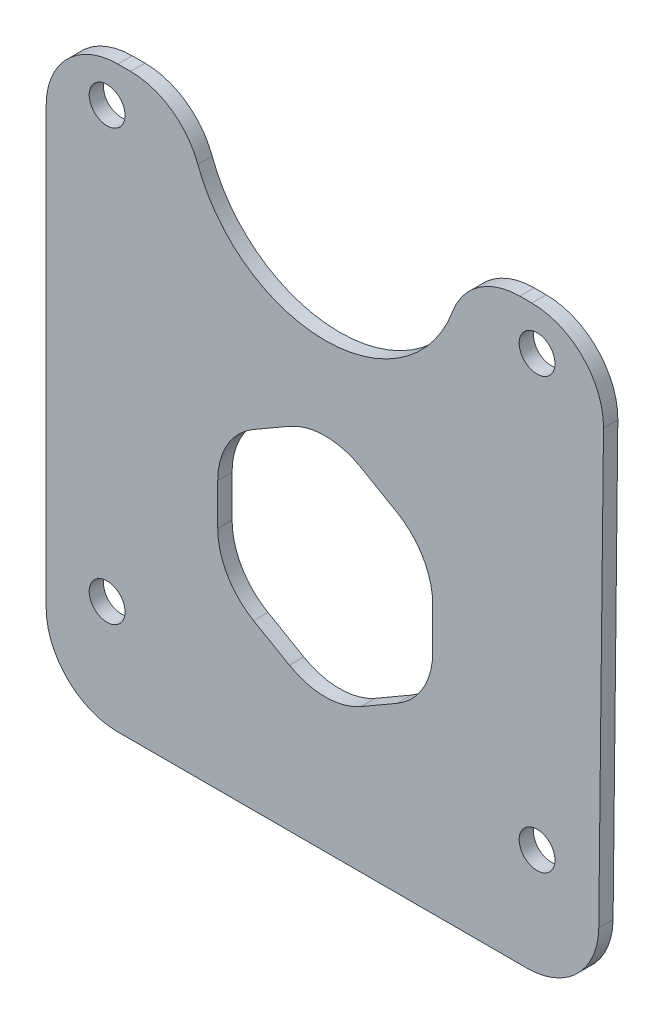
ISO-10303-21;
HEADER;
FILE_DESCRIPTION(('STEP AP214'),'2;1');
FILE_NAME('part.step','',(''),(''),'','','');
FILE_SCHEMA(('AUTOMOTIVE_DESIGN { 1 0 10303 214 1 1 1 1 }'));
ENDSEC;
DATA;
#1=APPLICATION_CONTEXT('core data for automotive mechanical design processes');
#2=APPLICATION_PROTOCOL_DEFINITION('international standard','automotive_design',2000,#1);
#3=PRODUCT_CONTEXT('',#1,'mechanical');
#4=PRODUCT('Part','Part','',(#3));
#5=PRODUCT_RELATED_PRODUCT_CATEGORY('part','',(#4));
#6=PRODUCT_DEFINITION_FORMATION('','',#4);
#7=PRODUCT_DEFINITION_CONTEXT('part definition',#1,'design');
#8=PRODUCT_DEFINITION('design','',#6,#7);
#9=PRODUCT_DEFINITION_SHAPE('','',#8);
#10=(LENGTH_UNIT() NAMED_UNIT(*) SI_UNIT(.MILLI.,.METRE.));
#11=(NAMED_UNIT(*) PLANE_ANGLE_UNIT() SI_UNIT($,.RADIAN.));
#12=(NAMED_UNIT(*) SI_UNIT($,.STERADIAN.) SOLID_ANGLE_UNIT());
#13=UNCERTAINTY_MEASURE_WITH_UNIT(LENGTH_MEASURE(1.E-05),#10,'distance_accuracy_value','');
#14=(GEOMETRIC_REPRESENTATION_CONTEXT(3) GLOBAL_UNCERTAINTY_ASSIGNED_CONTEXT((#13)) GLOBAL_UNIT_ASSIGNED_CONTEXT((#10,
#11,#12)) REPRESENTATION_CONTEXT('',''));
#15=CARTESIAN_POINT('',(0.,0.,0.));
#16=DIRECTION('',(0.,0.,1.));
#17=DIRECTION('',(1.,0.,0.));
#18=AXIS2_PLACEMENT_3D('',#15,#16,#17);
#19=CARTESIAN_POINT('',(0.,0.,2.));
#20=DIRECTION('',(0.,1.,0.));
#21=DIRECTION('',(0.,0.,1.));
#22=AXIS2_PLACEMENT_3D('',#19,#20,#21);
#23=PLANE('',#22);
#24=DIRECTION('',(1.,0.,0.));
#25=VECTOR('',#24,1.);
#26=CARTESIAN_POINT('',(0.,0.,2.));
#27=LINE('',#26,#25);
#28=CARTESIAN_POINT('',(30.,0.,2.));
#29=VERTEX_POINT('',#28);
#30=CARTESIAN_POINT('',(87.1084971040274,0.,2.));
#31=VERTEX_POINT('',#30);
#32=EDGE_CURVE('E228',#29,#31,#27,.T.);
#33=ORIENTED_EDGE('',*,*,#32,.F.);
#34=DIRECTION('',(0.,0.,-1.));
#35=VECTOR('',#34,1.);
#36=CARTESIAN_POINT('',(30.,0.,2.));
#37=LINE('',#36,#35);
#38=CARTESIAN_POINT('',(30.,0.,0.));
#39=VERTEX_POINT('',#38);
#40=EDGE_CURVE('E242',#29,#39,#37,.T.);
#41=ORIENTED_EDGE('',*,*,#40,.T.);
#42=DIRECTION('',(1.,0.,0.));
#43=VECTOR('',#42,1.);
#44=CARTESIAN_POINT('',(0.,0.,0.));
#45=LINE('',#44,#43);
#46=CARTESIAN_POINT('',(87.1084971040274,0.,0.));
#47=VERTEX_POINT('',#46);
#48=EDGE_CURVE('E219',#39,#47,#45,.T.);
#49=ORIENTED_EDGE('',*,*,#48,.T.);
#50=DIRECTION('',(0.,0.,1.));
#51=VECTOR('',#50,1.);
#52=CARTESIAN_POINT('',(87.1084971040274,0.,2.));
#53=LINE('',#52,#51);
#54=EDGE_CURVE('E239',#47,#31,#53,.T.);
#55=ORIENTED_EDGE('',*,*,#54,.T.);
#56=EDGE_LOOP('',(#33,#41,#49,#55));
#57=FACE_BOUND('',#56,.T.);
#58=ADVANCED_FACE('F39',(#57),#23,.F.);
#59=CARTESIAN_POINT('',(0.,0.,2.));
#60=DIRECTION('',(0.,0.,-1.));
#61=DIRECTION('',(-1.,0.,0.));
#62=AXIS2_PLACEMENT_3D('',#59,#60,#61);
#63=PLANE('',#62);
#64=DIRECTION('',(-0.866025403784439,0.5,0.));
#65=VECTOR('',#64,1.);
#66=CARTESIAN_POINT('',(22.1629020004135,38.387272307886,2.));
#67=LINE('',#66,#65);
#68=CARTESIAN_POINT('',(53.9402834671381,20.0405925639311,2.));
#69=VERTEX_POINT('',#68);
#70=CARTESIAN_POINT('',(48.9402834671381,22.9273439098793,2.));
#71=VERTEX_POINT('',#70);
#72=EDGE_CURVE('E358',#69,#71,#67,.T.);
#73=ORIENTED_EDGE('',*,*,#72,.T.);
#74=CARTESIAN_POINT('',(53.9402834671381,31.5875979477236,2.));
#75=DIRECTION('',(0.,0.,-1.));
#76=DIRECTION('',(-1.,0.,0.));
#77=AXIS2_PLACEMENT_3D('',#74,#75,#76);
#78=CIRCLE('',#77,10.);
#79=CARTESIAN_POINT('',(43.9402834671381,31.5875979477236,2.));
#80=VERTEX_POINT('',#79);
#81=EDGE_CURVE('E315',#71,#80,#78,.T.);
#82=ORIENTED_EDGE('',*,*,#81,.T.);
#83=DIRECTION('',(0.,1.,0.));
#84=VECTOR('',#83,1.);
#85=CARTESIAN_POINT('',(43.9402834671381,0.,2.));
#86=LINE('',#85,#84);
#87=CARTESIAN_POINT('',(43.9402834671381,37.3611006396199,2.));
#88=VERTEX_POINT('',#87);
#89=EDGE_CURVE('E361',#80,#88,#86,.T.);
#90=ORIENTED_EDGE('',*,*,#89,.T.);
#91=CARTESIAN_POINT('',(53.9402834671381,37.3611006396199,2.));
#92=DIRECTION('',(0.,0.,-1.));
#93=DIRECTION('',(-1.,0.,0.));
#94=AXIS2_PLACEMENT_3D('',#91,#92,#93);
#95=CIRCLE('',#94,10.);
#96=CARTESIAN_POINT('',(48.9402834671381,46.0213546774643,2.));
#97=VERTEX_POINT('',#96);
#98=EDGE_CURVE('E311',#88,#97,#95,.T.);
#99=ORIENTED_EDGE('',*,*,#98,.T.);
#100=DIRECTION('',(0.866025403784439,0.5,0.));
#101=VECTOR('',#100,1.);
#102=CARTESIAN_POINT('',(-7.69276026684442,13.3242516326217,2.));
#103=LINE('',#102,#101);
#104=CARTESIAN_POINT('',(53.9402834671381,48.9081060234124,2.));
#105=VERTEX_POINT('',#104);
#106=EDGE_CURVE('E364',#97,#105,#103,.T.);
#107=ORIENTED_EDGE('',*,*,#106,.T.);
#108=CARTESIAN_POINT('',(58.9402834671381,40.247851985568,2.));
#109=DIRECTION('',(0.,0.,-1.));
#110=DIRECTION('',(-1.,0.,0.));
#111=AXIS2_PLACEMENT_3D('',#108,#109,#110);
#112=CIRCLE('',#111,10.);
#113=CARTESIAN_POINT('',(63.9402834671381,48.9081060234124,2.));
#114=VERTEX_POINT('',#113);
#115=EDGE_CURVE('E11',#105,#114,#112,.T.);
#116=ORIENTED_EDGE('',*,*,#115,.T.);
#117=DIRECTION('',(0.866025403784439,-0.5,0.));
#118=VECTOR('',#117,1.);
#119=CARTESIAN_POINT('',(37.1629020004135,64.3680344214192,2.));
#120=LINE('',#119,#118);
#121=CARTESIAN_POINT('',(68.9402834671381,46.0213546774643,2.));
#122=VERTEX_POINT('',#121);
#123=EDGE_CURVE('E343',#114,#122,#120,.T.);
#124=ORIENTED_EDGE('',*,*,#123,.T.);
#125=CARTESIAN_POINT('',(63.9402834671381,37.3611006396199,2.));
#126=DIRECTION('',(0.,0.,-1.));
#127=DIRECTION('',(-1.,0.,0.));
#128=AXIS2_PLACEMENT_3D('',#125,#126,#127);
#129=CIRCLE('',#128,10.);
#130=CARTESIAN_POINT('',(73.9402834671381,37.3611006396199,2.));
#131=VERTEX_POINT('',#130);
#132=EDGE_CURVE('E327',#122,#131,#129,.T.);
#133=ORIENTED_EDGE('',*,*,#132,.T.);
#134=DIRECTION('',(0.,-1.,0.));
#135=VECTOR('',#134,1.);
#136=CARTESIAN_POINT('',(73.9402834671381,0.,2.));
#137=LINE('',#136,#135);
#138=CARTESIAN_POINT('',(73.9402834671381,31.5875979477236,2.));
#139=VERTEX_POINT('',#138);
#140=EDGE_CURVE('E345',#131,#139,#137,.T.);
#141=ORIENTED_EDGE('',*,*,#140,.T.);
#142=CARTESIAN_POINT('',(63.9402834671381,31.5875979477236,2.));
#143=DIRECTION('',(0.,0.,-1.));
#144=DIRECTION('',(-1.,0.,0.));
#145=AXIS2_PLACEMENT_3D('',#142,#143,#144);
#146=CIRCLE('',#145,10.);
#147=CARTESIAN_POINT('',(68.9402834671381,22.9273439098793,2.));
#148=VERTEX_POINT('',#147);
#149=EDGE_CURVE('E323',#139,#148,#146,.T.);
#150=ORIENTED_EDGE('',*,*,#149,.T.);
#151=DIRECTION('',(-0.866025403784439,-0.5,0.));
#152=VECTOR('',#151,1.);
#153=CARTESIAN_POINT('',(7.30723973315559,-12.6565104809115,2.));
#154=LINE('',#153,#152);
#155=CARTESIAN_POINT('',(63.9402834671381,20.0405925639311,2.));
#156=VERTEX_POINT('',#155);
#157=EDGE_CURVE('E349',#148,#156,#154,.T.);
#158=ORIENTED_EDGE('',*,*,#157,.T.);
#159=CARTESIAN_POINT('',(58.9402834671381,28.7008466017755,2.));
#160=DIRECTION('',(0.,0.,-1.));
#161=DIRECTION('',(-1.,0.,0.));
#162=AXIS2_PLACEMENT_3D('',#159,#160,#161);
#163=CIRCLE('',#162,10.);
#164=EDGE_CURVE('E319',#156,#69,#163,.T.);
#165=ORIENTED_EDGE('',*,*,#164,.T.);
#166=EDGE_LOOP('',(#73,#82,#90,#99,#107,#116,#124,#133,#141,#150,#158,#165));
#167=FACE_BOUND('',#166,.T.);
#168=CARTESIAN_POINT('',(28.5,15.,2.));
#169=DIRECTION('',(0.,0.,1.));
#170=DIRECTION('',(1.,0.,0.));
#171=AXIS2_PLACEMENT_3D('',#168,#169,#170);
#172=CIRCLE('',#171,2.5);
#173=CARTESIAN_POINT('',(31.,15.,2.));
#174=VERTEX_POINT('',#173);
#175=EDGE_CURVE('E390',#174,#174,#172,.T.);
#176=ORIENTED_EDGE('',*,*,#175,.F.);
#177=EDGE_LOOP('',(#176));
#178=FACE_BOUND('',#177,.T.);
#179=CARTESIAN_POINT('',(88.5,15.,2.));
#180=DIRECTION('',(0.,0.,1.));
#181=DIRECTION('',(1.,0.,0.));
#182=AXIS2_PLACEMENT_3D('',#179,#180,#181);
#183=CIRCLE('',#182,2.50000000000001);
#184=CARTESIAN_POINT('',(91.,15.,2.));
#185=VERTEX_POINT('',#184);
#186=EDGE_CURVE('E398',#185,#185,#183,.T.);
#187=ORIENTED_EDGE('',*,*,#186,.F.);
#188=EDGE_LOOP('',(#187));
#189=FACE_BOUND('',#188,.T.);
#190=CARTESIAN_POINT('',(88.5,75.,2.));
#191=DIRECTION('',(0.,0.,1.));
#192=DIRECTION('',(1.,0.,0.));
#193=AXIS2_PLACEMENT_3D('',#190,#191,#192);
#194=CIRCLE('',#193,2.5);
#195=CARTESIAN_POINT('',(91.,75.,2.));
#196=VERTEX_POINT('',#195);
#197=EDGE_CURVE('E395',#196,#196,#194,.T.);
#198=ORIENTED_EDGE('',*,*,#197,.F.);
#199=EDGE_LOOP('',(#198));
#200=FACE_BOUND('',#199,.T.);
#201=CARTESIAN_POINT('',(28.5,75.,2.));
#202=DIRECTION('',(0.,0.,1.));
#203=DIRECTION('',(1.,0.,0.));
#204=AXIS2_PLACEMENT_3D('',#201,#202,#203);
#205=CIRCLE('',#204,2.5);
#206=CARTESIAN_POINT('',(31.,75.,2.));
#207=VERTEX_POINT('',#206);
#208=EDGE_CURVE('E391',#207,#207,#205,.T.);
#209=ORIENTED_EDGE('',*,*,#208,.F.);
#210=EDGE_LOOP('',(#209));
#211=FACE_BOUND('',#210,.T.);
#212=DIRECTION('',(-1.,0.,0.));
#213=VECTOR('',#212,1.);
#214=CARTESIAN_POINT('',(0.,80.7177240732172,2.));
#215=LINE('',#214,#213);
#216=CARTESIAN_POINT('',(31.7825956576373,80.7177240732172,2.));
#217=VERTEX_POINT('',#216);
#218=CARTESIAN_POINT('',(30.,80.7177240732172,2.));
#219=VERTEX_POINT('',#218);
#220=EDGE_CURVE('E375',#217,#219,#215,.T.);
#221=ORIENTED_EDGE('',*,*,#220,.T.);
#222=CARTESIAN_POINT('',(30.,70.7177240732172,2.));
#223=DIRECTION('',(0.,0.,-1.));
#224=DIRECTION('',(-1.,0.,0.));
#225=AXIS2_PLACEMENT_3D('',#222,#223,#224);
#226=CIRCLE('',#225,10.);
#227=CARTESIAN_POINT('',(20.,70.7177240732172,2.));
#228=VERTEX_POINT('',#227);
#229=EDGE_CURVE('E266',#219,#228,#226,.F.);
#230=ORIENTED_EDGE('',*,*,#229,.T.);
#231=DIRECTION('',(0.,-1.,0.));
#232=VECTOR('',#231,1.);
#233=CARTESIAN_POINT('',(20.,0.,2.));
#234=LINE('',#233,#232);
#235=CARTESIAN_POINT('',(20.,10.,2.));
#236=VERTEX_POINT('',#235);
#237=EDGE_CURVE('E388',#228,#236,#234,.T.);
#238=ORIENTED_EDGE('',*,*,#237,.T.);
#239=CARTESIAN_POINT('',(30.,10.,2.));
#240=DIRECTION('',(0.,0.,-1.));
#241=DIRECTION('',(-1.,0.,0.));
#242=AXIS2_PLACEMENT_3D('',#239,#240,#241);
#243=CIRCLE('',#242,10.);
#244=EDGE_CURVE('E227',#236,#29,#243,.F.);
#245=ORIENTED_EDGE('',*,*,#244,.T.);
#246=ORIENTED_EDGE('',*,*,#32,.T.);
#247=CARTESIAN_POINT('',(87.1084971040274,10.,2.));
#248=DIRECTION('',(0.,0.,-1.));
#249=DIRECTION('',(-1.,0.,0.));
#250=AXIS2_PLACEMENT_3D('',#247,#248,#249);
#251=CIRCLE('',#250,10.);
#252=CARTESIAN_POINT('',(97.1079021023733,9.89091434991413,2.));
#253=VERTEX_POINT('',#252);
#254=EDGE_CURVE('E223',#31,#253,#251,.F.);
#255=ORIENTED_EDGE('',*,*,#254,.T.);
#256=DIRECTION('',(0.0109085650085876,0.999940499834592,0.));
#257=VECTOR('',#256,1.);
#258=CARTESIAN_POINT('',(96.988457311317,-1.05806784687503,2.));
#259=LINE('',#258,#257);
#260=CARTESIAN_POINT('',(97.7702847544769,70.6086384231313,2.));
#261=VERTEX_POINT('',#260);
#262=EDGE_CURVE('E384',#253,#261,#259,.T.);
#263=ORIENTED_EDGE('',*,*,#262,.T.);
#264=CARTESIAN_POINT('',(87.770879756131,70.7177240732172,2.));
#265=DIRECTION('',(0.,0.,-1.));
#266=DIRECTION('',(-1.,0.,0.));
#267=AXIS2_PLACEMENT_3D('',#264,#265,#266);
#268=CIRCLE('',#267,10.);
#269=CARTESIAN_POINT('',(87.770879756131,80.7177240732172,2.));
#270=VERTEX_POINT('',#269);
#271=EDGE_CURVE('E264',#261,#270,#268,.F.);
#272=ORIENTED_EDGE('',*,*,#271,.T.);
#273=DIRECTION('',(-1.,0.,0.));
#274=VECTOR('',#273,1.);
#275=CARTESIAN_POINT('',(0.,80.7177240732172,2.));
#276=LINE('',#275,#274);
#277=CARTESIAN_POINT('',(86.0979712766388,80.7177240732172,2.));
#278=VERTEX_POINT('',#277);
#279=EDGE_CURVE('E378',#270,#278,#276,.T.);
#280=ORIENTED_EDGE('',*,*,#279,.T.);
#281=CARTESIAN_POINT('',(86.0979712766388,70.7177240732172,2.));
#282=DIRECTION('',(0.,0.,-1.));
#283=DIRECTION('',(-1.,0.,0.));
#284=AXIS2_PLACEMENT_3D('',#281,#282,#283);
#285=CIRCLE('',#284,10.);
#286=CARTESIAN_POINT('',(76.713927806457,74.1731152449571,2.));
#287=VERTEX_POINT('',#286);
#288=EDGE_CURVE('E260',#278,#287,#285,.F.);
#289=ORIENTED_EDGE('',*,*,#288,.T.);
#290=CARTESIAN_POINT('',(58.9402834671381,80.7177240732172,2.));
#291=DIRECTION('',(0.,0.,-1.));
#292=DIRECTION('',(-1.,0.,0.));
#293=AXIS2_PLACEMENT_3D('',#290,#291,#292);
#294=CIRCLE('',#293,18.9402834671381);
#295=CARTESIAN_POINT('',(41.1666391278191,74.1731152449571,2.));
#296=VERTEX_POINT('',#295);
#297=EDGE_CURVE('E212',#287,#296,#294,.T.);
#298=ORIENTED_EDGE('',*,*,#297,.T.);
#299=CARTESIAN_POINT('',(31.7825956576373,70.7177240732172,2.));
#300=DIRECTION('',(0.,0.,-1.));
#301=DIRECTION('',(-1.,0.,0.));
#302=AXIS2_PLACEMENT_3D('',#299,#300,#301);
#303=CIRCLE('',#302,10.);
#304=EDGE_CURVE('E262',#296,#217,#303,.F.);
#305=ORIENTED_EDGE('',*,*,#304,.T.);
#306=EDGE_LOOP('',(#221,#230,#238,#245,#246,#255,#263,#272,#280,#289,#298,#305));
#307=FACE_BOUND('',#306,.T.);
#308=ADVANCED_FACE('F420',(#167,#178,#189,#200,#211,#307),#63,.F.);
#309=CARTESIAN_POINT('',(0.,0.,0.));
#310=DIRECTION('',(0.,0.,-1.));
#311=DIRECTION('',(-1.,0.,0.));
#312=AXIS2_PLACEMENT_3D('',#309,#310,#311);
#313=PLANE('',#312);
#314=DIRECTION('',(0.866025403784439,0.5,0.));
#315=VECTOR('',#314,1.);
#316=CARTESIAN_POINT('',(43.9402834671381,43.1346033315162,0.));
#317=LINE('',#316,#315);
#318=CARTESIAN_POINT('',(48.9402834671381,46.0213546774643,0.));
#319=VERTEX_POINT('',#318);
#320=CARTESIAN_POINT('',(53.9402834671381,48.9081060234124,0.));
#321=VERTEX_POINT('',#320);
#322=EDGE_CURVE('E332',#319,#321,#317,.T.);
#323=ORIENTED_EDGE('',*,*,#322,.F.);
#324=CARTESIAN_POINT('',(53.9402834671381,37.3611006396199,0.));
#325=DIRECTION('',(0.,0.,-1.));
#326=DIRECTION('',(-1.,0.,0.));
#327=AXIS2_PLACEMENT_3D('',#324,#325,#326);
#328=CIRCLE('',#327,10.);
#329=CARTESIAN_POINT('',(43.9402834671381,37.3611006396199,0.));
#330=VERTEX_POINT('',#329);
#331=EDGE_CURVE('E309',#319,#330,#328,.F.);
#332=ORIENTED_EDGE('',*,*,#331,.T.);
#333=DIRECTION('',(0.,1.,0.));
#334=VECTOR('',#333,1.);
#335=CARTESIAN_POINT('',(43.9402834671381,25.8140952558274,0.));
#336=LINE('',#335,#334);
#337=CARTESIAN_POINT('',(43.9402834671381,31.5875979477236,0.));
#338=VERTEX_POINT('',#337);
#339=EDGE_CURVE('E346',#338,#330,#336,.T.);
#340=ORIENTED_EDGE('',*,*,#339,.F.);
#341=CARTESIAN_POINT('',(53.9402834671381,31.5875979477236,0.));
#342=DIRECTION('',(0.,0.,-1.));
#343=DIRECTION('',(-1.,0.,0.));
#344=AXIS2_PLACEMENT_3D('',#341,#342,#343);
#345=CIRCLE('',#344,10.);
#346=CARTESIAN_POINT('',(48.9402834671381,22.9273439098793,0.));
#347=VERTEX_POINT('',#346);
#348=EDGE_CURVE('E313',#338,#347,#345,.F.);
#349=ORIENTED_EDGE('',*,*,#348,.T.);
#350=DIRECTION('',(-0.866025403784439,0.5,0.));
#351=VECTOR('',#350,1.);
#352=CARTESIAN_POINT('',(58.9402834671381,17.153841217983,0.));
#353=LINE('',#352,#351);
#354=CARTESIAN_POINT('',(53.9402834671381,20.0405925639311,0.));
#355=VERTEX_POINT('',#354);
#356=EDGE_CURVE('E352',#355,#347,#353,.T.);
#357=ORIENTED_EDGE('',*,*,#356,.F.);
#358=CARTESIAN_POINT('',(58.9402834671381,28.7008466017755,0.));
#359=DIRECTION('',(0.,0.,-1.));
#360=DIRECTION('',(-1.,0.,0.));
#361=AXIS2_PLACEMENT_3D('',#358,#359,#360);
#362=CIRCLE('',#361,10.);
#363=CARTESIAN_POINT('',(63.9402834671381,20.0405925639311,0.));
#364=VERTEX_POINT('',#363);
#365=EDGE_CURVE('E317',#355,#364,#362,.F.);
#366=ORIENTED_EDGE('',*,*,#365,.T.);
#367=DIRECTION('',(-0.866025403784439,-0.5,0.));
#368=VECTOR('',#367,1.);
#369=CARTESIAN_POINT('',(73.9402834671381,25.8140952558274,0.));
#370=LINE('',#369,#368);
#371=CARTESIAN_POINT('',(68.9402834671381,22.9273439098793,0.));
#372=VERTEX_POINT('',#371);
#373=EDGE_CURVE('E535',#372,#364,#370,.T.);
#374=ORIENTED_EDGE('',*,*,#373,.F.);
#375=CARTESIAN_POINT('',(63.9402834671381,31.5875979477236,0.));
#376=DIRECTION('',(0.,0.,-1.));
#377=DIRECTION('',(-1.,0.,0.));
#378=AXIS2_PLACEMENT_3D('',#375,#376,#377);
#379=CIRCLE('',#378,10.);
#380=CARTESIAN_POINT('',(73.9402834671381,31.5875979477236,0.));
#381=VERTEX_POINT('',#380);
#382=EDGE_CURVE('E321',#372,#381,#379,.F.);
#383=ORIENTED_EDGE('',*,*,#382,.T.);
#384=DIRECTION('',(0.,-1.,0.));
#385=VECTOR('',#384,1.);
#386=CARTESIAN_POINT('',(73.9402834671381,43.1346033315162,0.));
#387=LINE('',#386,#385);
#388=CARTESIAN_POINT('',(73.9402834671381,37.3611006396199,0.));
#389=VERTEX_POINT('',#388);
#390=EDGE_CURVE('E526',#389,#381,#387,.T.);
#391=ORIENTED_EDGE('',*,*,#390,.F.);
#392=CARTESIAN_POINT('',(63.9402834671381,37.3611006396199,0.));
#393=DIRECTION('',(0.,0.,-1.));
#394=DIRECTION('',(-1.,0.,0.));
#395=AXIS2_PLACEMENT_3D('',#392,#393,#394);
#396=CIRCLE('',#395,10.);
#397=CARTESIAN_POINT('',(68.9402834671381,46.0213546774643,0.));
#398=VERTEX_POINT('',#397);
#399=EDGE_CURVE('E325',#389,#398,#396,.F.);
#400=ORIENTED_EDGE('',*,*,#399,.T.);
#401=DIRECTION('',(0.866025403784438,-0.5,0.));
#402=VECTOR('',#401,1.);
#403=CARTESIAN_POINT('',(58.9402834671381,51.7948573693605,0.));
#404=LINE('',#403,#402);
#405=CARTESIAN_POINT('',(63.9402834671381,48.9081060234124,0.));
#406=VERTEX_POINT('',#405);
#407=EDGE_CURVE('E333',#406,#398,#404,.T.);
#408=ORIENTED_EDGE('',*,*,#407,.F.);
#409=CARTESIAN_POINT('',(58.9402834671381,40.247851985568,0.));
#410=DIRECTION('',(0.,0.,-1.));
#411=DIRECTION('',(-1.,0.,0.));
#412=AXIS2_PLACEMENT_3D('',#409,#410,#411);
#413=CIRCLE('',#412,10.);
#414=EDGE_CURVE('E47',#406,#321,#413,.F.);
#415=ORIENTED_EDGE('',*,*,#414,.T.);
#416=EDGE_LOOP('',(#323,#332,#340,#349,#357,#366,#374,#383,#391,#400,#408,#415));
#417=FACE_BOUND('',#416,.T.);
#418=DIRECTION('',(0.,-1.,0.));
#419=VECTOR('',#418,1.);
#420=CARTESIAN_POINT('',(20.,0.,0.));
#421=LINE('',#420,#419);
#422=CARTESIAN_POINT('',(20.,70.7177240732172,0.));
#423=VERTEX_POINT('',#422);
#424=CARTESIAN_POINT('',(20.,10.,0.));
#425=VERTEX_POINT('',#424);
#426=EDGE_CURVE('E201',#423,#425,#421,.T.);
#427=ORIENTED_EDGE('',*,*,#426,.F.);
#428=CARTESIAN_POINT('',(30.,70.7177240732172,0.));
#429=DIRECTION('',(0.,0.,-1.));
#430=DIRECTION('',(-1.,0.,0.));
#431=AXIS2_PLACEMENT_3D('',#428,#429,#430);
#432=CIRCLE('',#431,10.);
#433=CARTESIAN_POINT('',(30.,80.7177240732172,0.));
#434=VERTEX_POINT('',#433);
#435=EDGE_CURVE('E253',#423,#434,#432,.T.);
#436=ORIENTED_EDGE('',*,*,#435,.T.);
#437=DIRECTION('',(-1.,0.,0.));
#438=VECTOR('',#437,1.);
#439=CARTESIAN_POINT('',(40.,80.7177240732172,0.));
#440=LINE('',#439,#438);
#441=CARTESIAN_POINT('',(31.7825956576373,80.7177240732172,0.));
#442=VERTEX_POINT('',#441);
#443=EDGE_CURVE('E372',#442,#434,#440,.T.);
#444=ORIENTED_EDGE('',*,*,#443,.F.);
#445=CARTESIAN_POINT('',(31.7825956576373,70.7177240732172,0.));
#446=DIRECTION('',(0.,0.,-1.));
#447=DIRECTION('',(-1.,0.,0.));
#448=AXIS2_PLACEMENT_3D('',#445,#446,#447);
#449=CIRCLE('',#448,10.);
#450=CARTESIAN_POINT('',(41.1666391278191,74.1731152449571,0.));
#451=VERTEX_POINT('',#450);
#452=EDGE_CURVE('E249',#442,#451,#449,.T.);
#453=ORIENTED_EDGE('',*,*,#452,.T.);
#454=CARTESIAN_POINT('',(58.9402834671381,80.7177240732172,0.));
#455=DIRECTION('',(0.,0.,-1.));
#456=DIRECTION('',(-1.,0.,0.));
#457=AXIS2_PLACEMENT_3D('',#454,#455,#456);
#458=CIRCLE('',#457,18.9402834671381);
#459=CARTESIAN_POINT('',(76.713927806457,74.1731152449571,0.));
#460=VERTEX_POINT('',#459);
#461=EDGE_CURVE('E369',#460,#451,#458,.T.);
#462=ORIENTED_EDGE('',*,*,#461,.F.);
#463=CARTESIAN_POINT('',(86.0979712766388,70.7177240732172,0.));
#464=DIRECTION('',(0.,0.,-1.));
#465=DIRECTION('',(-1.,0.,0.));
#466=AXIS2_PLACEMENT_3D('',#463,#464,#465);
#467=CIRCLE('',#466,10.);
#468=CARTESIAN_POINT('',(86.0979712766388,80.7177240732172,0.));
#469=VERTEX_POINT('',#468);
#470=EDGE_CURVE('E247',#460,#469,#467,.T.);
#471=ORIENTED_EDGE('',*,*,#470,.T.);
#472=DIRECTION('',(-1.,0.,0.));
#473=VECTOR('',#472,1.);
#474=CARTESIAN_POINT('',(97.8805669342762,80.7177240732172,0.));
#475=LINE('',#474,#473);
#476=CARTESIAN_POINT('',(87.770879756131,80.7177240732172,0.));
#477=VERTEX_POINT('',#476);
#478=EDGE_CURVE('E366',#477,#469,#475,.T.);
#479=ORIENTED_EDGE('',*,*,#478,.F.);
#480=CARTESIAN_POINT('',(87.770879756131,70.7177240732172,0.));
#481=DIRECTION('',(0.,0.,-1.));
#482=DIRECTION('',(-1.,0.,0.));
#483=AXIS2_PLACEMENT_3D('',#480,#481,#482);
#484=CIRCLE('',#483,10.);
#485=CARTESIAN_POINT('',(97.7702847544769,70.6086384231313,0.));
#486=VERTEX_POINT('',#485);
#487=EDGE_CURVE('E251',#477,#486,#484,.T.);
#488=ORIENTED_EDGE('',*,*,#487,.T.);
#489=DIRECTION('',(0.0109085650085876,0.999940499834592,0.));
#490=VECTOR('',#489,1.);
#491=CARTESIAN_POINT('',(97.,0.,0.));
#492=LINE('',#491,#490);
#493=CARTESIAN_POINT('',(97.1079021023734,9.89091434991412,0.));
#494=VERTEX_POINT('',#493);
#495=EDGE_CURVE('E211',#494,#486,#492,.T.);
#496=ORIENTED_EDGE('',*,*,#495,.F.);
#497=CARTESIAN_POINT('',(87.1084971040274,10.,0.));
#498=DIRECTION('',(0.,0.,-1.));
#499=DIRECTION('',(-1.,0.,0.));
#500=AXIS2_PLACEMENT_3D('',#497,#498,#499);
#501=CIRCLE('',#500,10.);
#502=EDGE_CURVE('E224',#494,#47,#501,.T.);
#503=ORIENTED_EDGE('',*,*,#502,.T.);
#504=ORIENTED_EDGE('',*,*,#48,.F.);
#505=CARTESIAN_POINT('',(30.,10.,0.));
#506=DIRECTION('',(0.,0.,-1.));
#507=DIRECTION('',(-1.,0.,0.));
#508=AXIS2_PLACEMENT_3D('',#505,#506,#507);
#509=CIRCLE('',#508,10.);
#510=EDGE_CURVE('E215',#39,#425,#509,.T.);
#511=ORIENTED_EDGE('',*,*,#510,.T.);
#512=EDGE_LOOP('',(#427,#436,#444,#453,#462,#471,#479,#488,#496,#503,#504,#511));
#513=FACE_BOUND('',#512,.T.);
#514=CARTESIAN_POINT('',(28.5,15.,0.));
#515=DIRECTION('',(0.,0.,-1.));
#516=DIRECTION('',(-1.,0.,0.));
#517=AXIS2_PLACEMENT_3D('',#514,#515,#516);
#518=CIRCLE('',#517,2.5);
#519=CARTESIAN_POINT('',(26.,15.,0.));
#520=VERTEX_POINT('',#519);
#521=EDGE_CURVE('E234',#520,#520,#518,.T.);
#522=ORIENTED_EDGE('',*,*,#521,.F.);
#523=EDGE_LOOP('',(#522));
#524=FACE_BOUND('',#523,.T.);
#525=CARTESIAN_POINT('',(88.5,15.,0.));
#526=DIRECTION('',(0.,0.,-1.));
#527=DIRECTION('',(-1.,0.,0.));
#528=AXIS2_PLACEMENT_3D('',#525,#526,#527);
#529=CIRCLE('',#528,2.50000000000001);
#530=CARTESIAN_POINT('',(86.,15.,0.));
#531=VERTEX_POINT('',#530);
#532=EDGE_CURVE('E408',#531,#531,#529,.T.);
#533=ORIENTED_EDGE('',*,*,#532,.F.);
#534=EDGE_LOOP('',(#533));
#535=FACE_BOUND('',#534,.T.);
#536=CARTESIAN_POINT('',(88.5,75.,0.));
#537=DIRECTION('',(0.,0.,-1.));
#538=DIRECTION('',(-1.,0.,0.));
#539=AXIS2_PLACEMENT_3D('',#536,#537,#538);
#540=CIRCLE('',#539,2.5);
#541=CARTESIAN_POINT('',(86.,75.,0.));
#542=VERTEX_POINT('',#541);
#543=EDGE_CURVE('E406',#542,#542,#540,.T.);
#544=ORIENTED_EDGE('',*,*,#543,.F.);
#545=EDGE_LOOP('',(#544));
#546=FACE_BOUND('',#545,.T.);
#547=CARTESIAN_POINT('',(28.5,75.,0.));
#548=DIRECTION('',(0.,0.,-1.));
#549=DIRECTION('',(-1.,0.,0.));
#550=AXIS2_PLACEMENT_3D('',#547,#548,#549);
#551=CIRCLE('',#550,2.5);
#552=CARTESIAN_POINT('',(26.,75.,0.));
#553=VERTEX_POINT('',#552);
#554=EDGE_CURVE('E394',#553,#553,#551,.T.);
#555=ORIENTED_EDGE('',*,*,#554,.F.);
#556=EDGE_LOOP('',(#555));
#557=FACE_BOUND('',#556,.T.);
#558=ADVANCED_FACE('F216',(#417,#513,#524,#535,#546,#557),#313,.T.);
#559=CARTESIAN_POINT('',(28.5,75.,-28.));
#560=DIRECTION('',(0.,0.,1.));
#561=DIRECTION('',(1.,0.,0.));
#562=AXIS2_PLACEMENT_3D('',#559,#560,#561);
#563=CYLINDRICAL_SURFACE('',#562,2.5);
#564=ORIENTED_EDGE('',*,*,#554,.T.);
#565=EDGE_LOOP('',(#564));
#566=FACE_BOUND('',#565,.T.);
#567=ORIENTED_EDGE('',*,*,#208,.T.);
#568=EDGE_LOOP('',(#567));
#569=FACE_BOUND('',#568,.T.);
#570=ADVANCED_FACE('F419',(#566,#569),#563,.F.);
#571=CARTESIAN_POINT('',(88.5,75.,-28.));
#572=DIRECTION('',(0.,0.,1.));
#573=DIRECTION('',(1.,0.,0.));
#574=AXIS2_PLACEMENT_3D('',#571,#572,#573);
#575=CYLINDRICAL_SURFACE('',#574,2.5);
#576=ORIENTED_EDGE('',*,*,#543,.T.);
#577=EDGE_LOOP('',(#576));
#578=FACE_BOUND('',#577,.T.);
#579=ORIENTED_EDGE('',*,*,#197,.T.);
#580=EDGE_LOOP('',(#579));
#581=FACE_BOUND('',#580,.T.);
#582=ADVANCED_FACE('F429',(#578,#581),#575,.F.);
#583=CARTESIAN_POINT('',(88.5,15.,-28.));
#584=DIRECTION('',(0.,0.,1.));
#585=DIRECTION('',(1.,0.,0.));
#586=AXIS2_PLACEMENT_3D('',#583,#584,#585);
#587=CYLINDRICAL_SURFACE('',#586,2.50000000000001);
#588=ORIENTED_EDGE('',*,*,#532,.T.);
#589=EDGE_LOOP('',(#588));
#590=FACE_BOUND('',#589,.T.);
#591=ORIENTED_EDGE('',*,*,#186,.T.);
#592=EDGE_LOOP('',(#591));
#593=FACE_BOUND('',#592,.T.);
#594=ADVANCED_FACE('F581',(#590,#593),#587,.F.);
#595=CARTESIAN_POINT('',(28.5,15.,-28.));
#596=DIRECTION('',(0.,0.,1.));
#597=DIRECTION('',(1.,0.,0.));
#598=AXIS2_PLACEMENT_3D('',#595,#596,#597);
#599=CYLINDRICAL_SURFACE('',#598,2.5);
#600=ORIENTED_EDGE('',*,*,#521,.T.);
#601=EDGE_LOOP('',(#600));
#602=FACE_BOUND('',#601,.T.);
#603=ORIENTED_EDGE('',*,*,#175,.T.);
#604=EDGE_LOOP('',(#603));
#605=FACE_BOUND('',#604,.T.);
#606=ADVANCED_FACE('F415',(#602,#605),#599,.F.);
#607=CARTESIAN_POINT('',(97.,0.,10.));
#608=DIRECTION('',(-0.999940499834592,0.0109085650085876,0.));
#609=DIRECTION('',(-0.0109085650085876,-0.999940499834592,0.));
#610=AXIS2_PLACEMENT_3D('',#607,#608,#609);
#611=PLANE('',#610);
#612=ORIENTED_EDGE('',*,*,#495,.T.);
#613=DIRECTION('',(0.,0.,-1.));
#614=VECTOR('',#613,1.);
#615=CARTESIAN_POINT('',(97.7702847544769,70.6086384231313,10.));
#616=LINE('',#615,#614);
#617=EDGE_CURVE('E273',#486,#261,#616,.F.);
#618=ORIENTED_EDGE('',*,*,#617,.T.);
#619=ORIENTED_EDGE('',*,*,#262,.F.);
#620=DIRECTION('',(0.,0.,1.));
#621=VECTOR('',#620,1.);
#622=CARTESIAN_POINT('',(97.1079021023734,9.89091434991413,10.));
#623=LINE('',#622,#621);
#624=EDGE_CURVE('E244',#253,#494,#623,.F.);
#625=ORIENTED_EDGE('',*,*,#624,.T.);
#626=EDGE_LOOP('',(#612,#618,#619,#625));
#627=FACE_BOUND('',#626,.T.);
#628=ADVANCED_FACE('F470',(#627),#611,.F.);
#629=CARTESIAN_POINT('',(20.,0.,10.));
#630=DIRECTION('',(1.,0.,0.));
#631=DIRECTION('',(0.,1.,0.));
#632=AXIS2_PLACEMENT_3D('',#629,#630,#631);
#633=PLANE('',#632);
#634=ORIENTED_EDGE('',*,*,#237,.F.);
#635=DIRECTION('',(0.,0.,-1.));
#636=VECTOR('',#635,1.);
#637=CARTESIAN_POINT('',(20.,70.7177240732172,10.));
#638=LINE('',#637,#636);
#639=EDGE_CURVE('E209',#228,#423,#638,.T.);
#640=ORIENTED_EDGE('',*,*,#639,.T.);
#641=ORIENTED_EDGE('',*,*,#426,.T.);
#642=DIRECTION('',(0.,0.,-1.));
#643=VECTOR('',#642,1.);
#644=CARTESIAN_POINT('',(20.,10.,10.));
#645=LINE('',#644,#643);
#646=EDGE_CURVE('E206',#425,#236,#645,.F.);
#647=ORIENTED_EDGE('',*,*,#646,.T.);
#648=EDGE_LOOP('',(#634,#640,#641,#647));
#649=FACE_BOUND('',#648,.T.);
#650=ADVANCED_FACE('F204',(#649),#633,.F.);
#651=CARTESIAN_POINT('',(30.,10.,2.));
#652=DIRECTION('',(0.,0.,-1.));
#653=DIRECTION('',(-1.,0.,0.));
#654=AXIS2_PLACEMENT_3D('',#651,#652,#653);
#655=CYLINDRICAL_SURFACE('',#654,10.);
#656=ORIENTED_EDGE('',*,*,#244,.F.);
#657=ORIENTED_EDGE('',*,*,#646,.F.);
#658=ORIENTED_EDGE('',*,*,#510,.F.);
#659=ORIENTED_EDGE('',*,*,#40,.F.);
#660=EDGE_LOOP('',(#656,#657,#658,#659));
#661=FACE_BOUND('',#660,.T.);
#662=ADVANCED_FACE('F226',(#661),#655,.T.);
#663=CARTESIAN_POINT('',(87.1084971040274,10.,2.));
#664=DIRECTION('',(0.,0.,1.));
#665=DIRECTION('',(1.,0.,0.));
#666=AXIS2_PLACEMENT_3D('',#663,#664,#665);
#667=CYLINDRICAL_SURFACE('',#666,10.);
#668=ORIENTED_EDGE('',*,*,#502,.F.);
#669=ORIENTED_EDGE('',*,*,#624,.F.);
#670=ORIENTED_EDGE('',*,*,#254,.F.);
#671=ORIENTED_EDGE('',*,*,#54,.F.);
#672=EDGE_LOOP('',(#668,#669,#670,#671));
#673=FACE_BOUND('',#672,.T.);
#674=ADVANCED_FACE('F474',(#673),#667,.T.);
#675=CARTESIAN_POINT('',(58.9402834671381,80.7177240732172,10.));
#676=DIRECTION('',(0.,0.,-1.));
#677=DIRECTION('',(-1.,0.,0.));
#678=AXIS2_PLACEMENT_3D('',#675,#676,#677);
#679=CYLINDRICAL_SURFACE('',#678,18.9402834671381);
#680=ORIENTED_EDGE('',*,*,#461,.T.);
#681=DIRECTION('',(0.,0.,-1.));
#682=VECTOR('',#681,1.);
#683=CARTESIAN_POINT('',(41.1666391278191,74.1731152449571,10.));
#684=LINE('',#683,#682);
#685=EDGE_CURVE('E278',#451,#296,#684,.F.);
#686=ORIENTED_EDGE('',*,*,#685,.T.);
#687=ORIENTED_EDGE('',*,*,#297,.F.);
#688=DIRECTION('',(0.,0.,-1.));
#689=VECTOR('',#688,1.);
#690=CARTESIAN_POINT('',(76.713927806457,74.1731152449571,10.));
#691=LINE('',#690,#689);
#692=EDGE_CURVE('E275',#287,#460,#691,.T.);
#693=ORIENTED_EDGE('',*,*,#692,.T.);
#694=EDGE_LOOP('',(#680,#686,#687,#693));
#695=FACE_BOUND('',#694,.T.);
#696=ADVANCED_FACE('F451',(#695),#679,.F.);
#697=CARTESIAN_POINT('',(97.8805669342762,80.7177240732172,10.));
#698=DIRECTION('',(0.,-1.,0.));
#699=DIRECTION('',(0.,0.,-1.));
#700=AXIS2_PLACEMENT_3D('',#697,#698,#699);
#701=PLANE('',#700);
#702=ORIENTED_EDGE('',*,*,#279,.F.);
#703=DIRECTION('',(0.,0.,-1.));
#704=VECTOR('',#703,1.);
#705=CARTESIAN_POINT('',(87.770879756131,80.7177240732172,10.));
#706=LINE('',#705,#704);
#707=EDGE_CURVE('E270',#270,#477,#706,.T.);
#708=ORIENTED_EDGE('',*,*,#707,.T.);
#709=ORIENTED_EDGE('',*,*,#478,.T.);
#710=DIRECTION('',(0.,0.,-1.));
#711=VECTOR('',#710,1.);
#712=CARTESIAN_POINT('',(86.0979712766388,80.7177240732172,10.));
#713=LINE('',#712,#711);
#714=EDGE_CURVE('E268',#469,#278,#713,.F.);
#715=ORIENTED_EDGE('',*,*,#714,.T.);
#716=EDGE_LOOP('',(#702,#708,#709,#715));
#717=FACE_BOUND('',#716,.T.);
#718=ADVANCED_FACE('F461',(#717),#701,.F.);
#719=CARTESIAN_POINT('',(40.,80.7177240732172,10.));
#720=DIRECTION('',(0.,-1.,0.));
#721=DIRECTION('',(0.,0.,-1.));
#722=AXIS2_PLACEMENT_3D('',#719,#720,#721);
#723=PLANE('',#722);
#724=ORIENTED_EDGE('',*,*,#443,.T.);
#725=DIRECTION('',(0.,0.,-1.));
#726=VECTOR('',#725,1.);
#727=CARTESIAN_POINT('',(30.,80.7177240732172,10.));
#728=LINE('',#727,#726);
#729=EDGE_CURVE('E258',#434,#219,#728,.F.);
#730=ORIENTED_EDGE('',*,*,#729,.T.);
#731=ORIENTED_EDGE('',*,*,#220,.F.);
#732=DIRECTION('',(0.,0.,-1.));
#733=VECTOR('',#732,1.);
#734=CARTESIAN_POINT('',(31.7825956576373,80.7177240732172,10.));
#735=LINE('',#734,#733);
#736=EDGE_CURVE('E255',#217,#442,#735,.T.);
#737=ORIENTED_EDGE('',*,*,#736,.T.);
#738=EDGE_LOOP('',(#724,#730,#731,#737));
#739=FACE_BOUND('',#738,.T.);
#740=ADVANCED_FACE('F445',(#739),#723,.F.);
#741=CARTESIAN_POINT('',(30.,70.7177240732172,10.));
#742=DIRECTION('',(0.,0.,-1.));
#743=DIRECTION('',(-1.,0.,0.));
#744=AXIS2_PLACEMENT_3D('',#741,#742,#743);
#745=CYLINDRICAL_SURFACE('',#744,10.);
#746=ORIENTED_EDGE('',*,*,#229,.F.);
#747=ORIENTED_EDGE('',*,*,#729,.F.);
#748=ORIENTED_EDGE('',*,*,#435,.F.);
#749=ORIENTED_EDGE('',*,*,#639,.F.);
#750=EDGE_LOOP('',(#746,#747,#748,#749));
#751=FACE_BOUND('',#750,.T.);
#752=ADVANCED_FACE('F443',(#751),#745,.T.);
#753=CARTESIAN_POINT('',(87.770879756131,70.7177240732172,10.));
#754=DIRECTION('',(0.,0.,-1.));
#755=DIRECTION('',(-1.,0.,0.));
#756=AXIS2_PLACEMENT_3D('',#753,#754,#755);
#757=CYLINDRICAL_SURFACE('',#756,10.);
#758=ORIENTED_EDGE('',*,*,#271,.F.);
#759=ORIENTED_EDGE('',*,*,#617,.F.);
#760=ORIENTED_EDGE('',*,*,#487,.F.);
#761=ORIENTED_EDGE('',*,*,#707,.F.);
#762=EDGE_LOOP('',(#758,#759,#760,#761));
#763=FACE_BOUND('',#762,.T.);
#764=ADVANCED_FACE('F465',(#763),#757,.T.);
#765=CARTESIAN_POINT('',(31.7825956576373,70.7177240732172,10.));
#766=DIRECTION('',(0.,0.,-1.));
#767=DIRECTION('',(-1.,0.,0.));
#768=AXIS2_PLACEMENT_3D('',#765,#766,#767);
#769=CYLINDRICAL_SURFACE('',#768,10.);
#770=ORIENTED_EDGE('',*,*,#304,.F.);
#771=ORIENTED_EDGE('',*,*,#685,.F.);
#772=ORIENTED_EDGE('',*,*,#452,.F.);
#773=ORIENTED_EDGE('',*,*,#736,.F.);
#774=EDGE_LOOP('',(#770,#771,#772,#773));
#775=FACE_BOUND('',#774,.T.);
#776=ADVANCED_FACE('F447',(#775),#769,.T.);
#777=CARTESIAN_POINT('',(86.0979712766388,70.7177240732172,10.));
#778=DIRECTION('',(0.,0.,-1.));
#779=DIRECTION('',(-1.,0.,0.));
#780=AXIS2_PLACEMENT_3D('',#777,#778,#779);
#781=CYLINDRICAL_SURFACE('',#780,10.);
#782=ORIENTED_EDGE('',*,*,#288,.F.);
#783=ORIENTED_EDGE('',*,*,#714,.F.);
#784=ORIENTED_EDGE('',*,*,#470,.F.);
#785=ORIENTED_EDGE('',*,*,#692,.F.);
#786=EDGE_LOOP('',(#782,#783,#784,#785));
#787=FACE_BOUND('',#786,.T.);
#788=ADVANCED_FACE('F456',(#787),#781,.T.);
#789=CARTESIAN_POINT('',(43.9402834671381,43.1346033315162,10.));
#790=DIRECTION('',(-0.5,0.866025403784439,0.));
#791=DIRECTION('',(-0.866025403784439,-0.5,0.));
#792=AXIS2_PLACEMENT_3D('',#789,#790,#791);
#793=PLANE('',#792);
#794=ORIENTED_EDGE('',*,*,#106,.F.);
#795=DIRECTION('',(0.,0.,-1.));
#796=VECTOR('',#795,1.);
#797=CARTESIAN_POINT('',(48.9402834671381,46.0213546774643,0.));
#798=LINE('',#797,#796);
#799=EDGE_CURVE('E282',#97,#319,#798,.T.);
#800=ORIENTED_EDGE('',*,*,#799,.T.);
#801=ORIENTED_EDGE('',*,*,#322,.T.);
#802=DIRECTION('',(0.,0.,-1.));
#803=VECTOR('',#802,1.);
#804=CARTESIAN_POINT('',(53.9402834671381,48.9081060234124,2.));
#805=LINE('',#804,#803);
#806=EDGE_CURVE('E280',#321,#105,#805,.F.);
#807=ORIENTED_EDGE('',*,*,#806,.T.);
#808=EDGE_LOOP('',(#794,#800,#801,#807));
#809=FACE_BOUND('',#808,.T.);
#810=ADVANCED_FACE('F339',(#809),#793,.F.);
#811=CARTESIAN_POINT('',(43.9402834671381,25.8140952558274,10.));
#812=DIRECTION('',(-1.,0.,0.));
#813=DIRECTION('',(0.,0.,1.));
#814=AXIS2_PLACEMENT_3D('',#811,#812,#813);
#815=PLANE('',#814);
#816=ORIENTED_EDGE('',*,*,#339,.T.);
#817=DIRECTION('',(0.,0.,-1.));
#818=VECTOR('',#817,1.);
#819=CARTESIAN_POINT('',(43.9402834671381,37.3611006396199,2.));
#820=LINE('',#819,#818);
#821=EDGE_CURVE('E288',#330,#88,#820,.F.);
#822=ORIENTED_EDGE('',*,*,#821,.T.);
#823=ORIENTED_EDGE('',*,*,#89,.F.);
#824=DIRECTION('',(0.,0.,-1.));
#825=VECTOR('',#824,1.);
#826=CARTESIAN_POINT('',(43.9402834671381,31.5875979477236,0.));
#827=LINE('',#826,#825);
#828=EDGE_CURVE('E285',#80,#338,#827,.T.);
#829=ORIENTED_EDGE('',*,*,#828,.T.);
#830=EDGE_LOOP('',(#816,#822,#823,#829));
#831=FACE_BOUND('',#830,.T.);
#832=ADVANCED_FACE('F548',(#831),#815,.F.);
#833=CARTESIAN_POINT('',(58.9402834671381,17.153841217983,10.));
#834=DIRECTION('',(-0.5,-0.866025403784439,0.));
#835=DIRECTION('',(0.866025403784439,-0.5,0.));
#836=AXIS2_PLACEMENT_3D('',#833,#834,#835);
#837=PLANE('',#836);
#838=ORIENTED_EDGE('',*,*,#356,.T.);
#839=DIRECTION('',(0.,0.,-1.));
#840=VECTOR('',#839,1.);
#841=CARTESIAN_POINT('',(48.9402834671381,22.9273439098793,2.));
#842=LINE('',#841,#840);
#843=EDGE_CURVE('E293',#347,#71,#842,.F.);
#844=ORIENTED_EDGE('',*,*,#843,.T.);
#845=ORIENTED_EDGE('',*,*,#72,.F.);
#846=DIRECTION('',(0.,0.,-1.));
#847=VECTOR('',#846,1.);
#848=CARTESIAN_POINT('',(53.9402834671381,20.0405925639311,0.));
#849=LINE('',#848,#847);
#850=EDGE_CURVE('E290',#69,#355,#849,.T.);
#851=ORIENTED_EDGE('',*,*,#850,.T.);
#852=EDGE_LOOP('',(#838,#844,#845,#851));
#853=FACE_BOUND('',#852,.T.);
#854=ADVANCED_FACE('F541',(#853),#837,.F.);
#855=CARTESIAN_POINT('',(73.9402834671381,25.8140952558274,10.));
#856=DIRECTION('',(0.5,-0.866025403784439,0.));
#857=DIRECTION('',(0.866025403784439,0.5,0.));
#858=AXIS2_PLACEMENT_3D('',#855,#856,#857);
#859=PLANE('',#858);
#860=ORIENTED_EDGE('',*,*,#373,.T.);
#861=DIRECTION('',(0.,0.,-1.));
#862=VECTOR('',#861,1.);
#863=CARTESIAN_POINT('',(63.9402834671381,20.0405925639311,2.));
#864=LINE('',#863,#862);
#865=EDGE_CURVE('E298',#364,#156,#864,.F.);
#866=ORIENTED_EDGE('',*,*,#865,.T.);
#867=ORIENTED_EDGE('',*,*,#157,.F.);
#868=DIRECTION('',(0.,0.,-1.));
#869=VECTOR('',#868,1.);
#870=CARTESIAN_POINT('',(68.9402834671381,22.9273439098793,0.));
#871=LINE('',#870,#869);
#872=EDGE_CURVE('E295',#148,#372,#871,.T.);
#873=ORIENTED_EDGE('',*,*,#872,.T.);
#874=EDGE_LOOP('',(#860,#866,#867,#873));
#875=FACE_BOUND('',#874,.T.);
#876=ADVANCED_FACE('F532',(#875),#859,.F.);
#877=CARTESIAN_POINT('',(73.9402834671381,43.1346033315162,10.));
#878=DIRECTION('',(1.,0.,0.));
#879=DIRECTION('',(0.,0.,-1.));
#880=AXIS2_PLACEMENT_3D('',#877,#878,#879);
#881=PLANE('',#880);
#882=ORIENTED_EDGE('',*,*,#390,.T.);
#883=DIRECTION('',(0.,0.,-1.));
#884=VECTOR('',#883,1.);
#885=CARTESIAN_POINT('',(73.9402834671381,31.5875979477236,2.));
#886=LINE('',#885,#884);
#887=EDGE_CURVE('E303',#381,#139,#886,.F.);
#888=ORIENTED_EDGE('',*,*,#887,.T.);
#889=ORIENTED_EDGE('',*,*,#140,.F.);
#890=DIRECTION('',(0.,0.,-1.));
#891=VECTOR('',#890,1.);
#892=CARTESIAN_POINT('',(73.9402834671381,37.3611006396199,0.));
#893=LINE('',#892,#891);
#894=EDGE_CURVE('E300',#131,#389,#893,.T.);
#895=ORIENTED_EDGE('',*,*,#894,.T.);
#896=EDGE_LOOP('',(#882,#888,#889,#895));
#897=FACE_BOUND('',#896,.T.);
#898=ADVANCED_FACE('F523',(#897),#881,.F.);
#899=CARTESIAN_POINT('',(58.9402834671381,51.7948573693605,10.));
#900=DIRECTION('',(0.5,0.866025403784438,0.));
#901=DIRECTION('',(-0.866025403784439,0.5,0.));
#902=AXIS2_PLACEMENT_3D('',#899,#900,#901);
#903=PLANE('',#902);
#904=ORIENTED_EDGE('',*,*,#407,.T.);
#905=DIRECTION('',(0.,0.,-1.));
#906=VECTOR('',#905,1.);
#907=CARTESIAN_POINT('',(68.9402834671381,46.0213546774643,2.));
#908=LINE('',#907,#906);
#909=EDGE_CURVE('E54',#398,#122,#908,.F.);
#910=ORIENTED_EDGE('',*,*,#909,.T.);
#911=ORIENTED_EDGE('',*,*,#123,.F.);
#912=DIRECTION('',(0.,0.,-1.));
#913=VECTOR('',#912,1.);
#914=CARTESIAN_POINT('',(63.9402834671381,48.9081060234124,0.));
#915=LINE('',#914,#913);
#916=EDGE_CURVE('E305',#114,#406,#915,.T.);
#917=ORIENTED_EDGE('',*,*,#916,.T.);
#918=EDGE_LOOP('',(#904,#910,#911,#917));
#919=FACE_BOUND('',#918,.T.);
#920=ADVANCED_FACE('F342',(#919),#903,.F.);
#921=CARTESIAN_POINT('',(53.9402834671381,37.3611006396199,10.));
#922=DIRECTION('',(0.,0.,1.));
#923=DIRECTION('',(1.,0.,0.));
#924=AXIS2_PLACEMENT_3D('',#921,#922,#923);
#925=CYLINDRICAL_SURFACE('',#924,10.);
#926=ORIENTED_EDGE('',*,*,#98,.F.);
#927=ORIENTED_EDGE('',*,*,#821,.F.);
#928=ORIENTED_EDGE('',*,*,#331,.F.);
#929=ORIENTED_EDGE('',*,*,#799,.F.);
#930=EDGE_LOOP('',(#926,#927,#928,#929));
#931=FACE_BOUND('',#930,.T.);
#932=ADVANCED_FACE('F496',(#931),#925,.F.);
#933=CARTESIAN_POINT('',(53.9402834671381,31.5875979477236,10.));
#934=DIRECTION('',(0.,0.,1.));
#935=DIRECTION('',(1.,0.,0.));
#936=AXIS2_PLACEMENT_3D('',#933,#934,#935);
#937=CYLINDRICAL_SURFACE('',#936,10.);
#938=ORIENTED_EDGE('',*,*,#81,.F.);
#939=ORIENTED_EDGE('',*,*,#843,.F.);
#940=ORIENTED_EDGE('',*,*,#348,.F.);
#941=ORIENTED_EDGE('',*,*,#828,.F.);
#942=EDGE_LOOP('',(#938,#939,#940,#941));
#943=FACE_BOUND('',#942,.T.);
#944=ADVANCED_FACE('F499',(#943),#937,.F.);
#945=CARTESIAN_POINT('',(58.9402834671381,28.7008466017755,10.));
#946=DIRECTION('',(0.,0.,1.));
#947=DIRECTION('',(1.,0.,0.));
#948=AXIS2_PLACEMENT_3D('',#945,#946,#947);
#949=CYLINDRICAL_SURFACE('',#948,10.);
#950=ORIENTED_EDGE('',*,*,#164,.F.);
#951=ORIENTED_EDGE('',*,*,#865,.F.);
#952=ORIENTED_EDGE('',*,*,#365,.F.);
#953=ORIENTED_EDGE('',*,*,#850,.F.);
#954=EDGE_LOOP('',(#950,#951,#952,#953));
#955=FACE_BOUND('',#954,.T.);
#956=ADVANCED_FACE('F503',(#955),#949,.F.);
#957=CARTESIAN_POINT('',(63.9402834671381,31.5875979477236,10.));
#958=DIRECTION('',(0.,0.,1.));
#959=DIRECTION('',(1.,0.,0.));
#960=AXIS2_PLACEMENT_3D('',#957,#958,#959);
#961=CYLINDRICAL_SURFACE('',#960,10.);
#962=ORIENTED_EDGE('',*,*,#149,.F.);
#963=ORIENTED_EDGE('',*,*,#887,.F.);
#964=ORIENTED_EDGE('',*,*,#382,.F.);
#965=ORIENTED_EDGE('',*,*,#872,.F.);
#966=EDGE_LOOP('',(#962,#963,#964,#965));
#967=FACE_BOUND('',#966,.T.);
#968=ADVANCED_FACE('F507',(#967),#961,.F.);
#969=CARTESIAN_POINT('',(63.9402834671381,37.3611006396199,10.));
#970=DIRECTION('',(0.,0.,1.));
#971=DIRECTION('',(1.,0.,0.));
#972=AXIS2_PLACEMENT_3D('',#969,#970,#971);
#973=CYLINDRICAL_SURFACE('',#972,10.);
#974=ORIENTED_EDGE('',*,*,#132,.F.);
#975=ORIENTED_EDGE('',*,*,#909,.F.);
#976=ORIENTED_EDGE('',*,*,#399,.F.);
#977=ORIENTED_EDGE('',*,*,#894,.F.);
#978=EDGE_LOOP('',(#974,#975,#976,#977));
#979=FACE_BOUND('',#978,.T.);
#980=ADVANCED_FACE('F510',(#979),#973,.F.);
#981=CARTESIAN_POINT('',(58.9402834671381,40.247851985568,10.));
#982=DIRECTION('',(0.,0.,1.));
#983=DIRECTION('',(1.,0.,0.));
#984=AXIS2_PLACEMENT_3D('',#981,#982,#983);
#985=CYLINDRICAL_SURFACE('',#984,10.);
#986=ORIENTED_EDGE('',*,*,#115,.F.);
#987=ORIENTED_EDGE('',*,*,#806,.F.);
#988=ORIENTED_EDGE('',*,*,#414,.F.);
#989=ORIENTED_EDGE('',*,*,#916,.F.);
#990=EDGE_LOOP('',(#986,#987,#988,#989));
#991=FACE_BOUND('',#990,.T.);
#992=ADVANCED_FACE('F41',(#991),#985,.F.);
#993=CLOSED_SHELL('',(#58,#308,#558,#570,#582,#594,#606,#628,#650,#662,#674,#696,#718,#740,#752,
#764,#776,#788,#810,#832,#854,#876,#898,#920,#932,#944,#956,#968,#980,#992));
#994=MANIFOLD_SOLID_BREP('B2',#993);
#995=ADVANCED_BREP_SHAPE_REPRESENTATION('',(#18,#994),#14);
#996=SHAPE_DEFINITION_REPRESENTATION(#9,#995);
ENDSEC;
END-ISO-10303-21;
